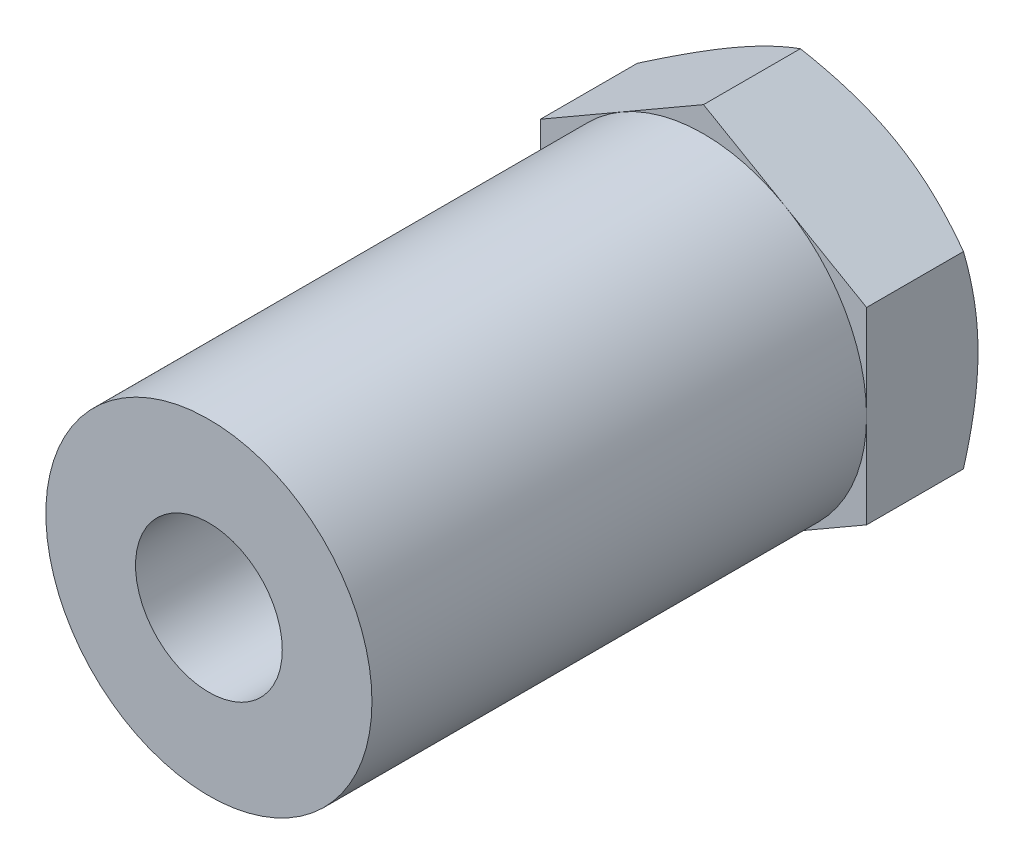
ISO-10303-21;
HEADER;
FILE_DESCRIPTION(('STEP AP214'),'2;1');
FILE_NAME('part.step','',(''),(''),'','','');
FILE_SCHEMA(('AUTOMOTIVE_DESIGN { 1 0 10303 214 1 1 1 1 }'));
ENDSEC;
DATA;
#1=APPLICATION_CONTEXT('core data for automotive mechanical design processes');
#2=APPLICATION_PROTOCOL_DEFINITION('international standard','automotive_design',2000,#1);
#3=PRODUCT_CONTEXT('',#1,'mechanical');
#4=PRODUCT('Part','Part','',(#3));
#5=PRODUCT_RELATED_PRODUCT_CATEGORY('part','',(#4));
#6=PRODUCT_DEFINITION_FORMATION('','',#4);
#7=PRODUCT_DEFINITION_CONTEXT('part definition',#1,'design');
#8=PRODUCT_DEFINITION('design','',#6,#7);
#9=PRODUCT_DEFINITION_SHAPE('','',#8);
#10=(LENGTH_UNIT() NAMED_UNIT(*) SI_UNIT(.MILLI.,.METRE.));
#11=(NAMED_UNIT(*) PLANE_ANGLE_UNIT() SI_UNIT($,.RADIAN.));
#12=(NAMED_UNIT(*) SI_UNIT($,.STERADIAN.) SOLID_ANGLE_UNIT());
#13=UNCERTAINTY_MEASURE_WITH_UNIT(LENGTH_MEASURE(1.E-05),#10,'distance_accuracy_value','');
#14=(GEOMETRIC_REPRESENTATION_CONTEXT(3) GLOBAL_UNCERTAINTY_ASSIGNED_CONTEXT((#13)) GLOBAL_UNIT_ASSIGNED_CONTEXT((#10,
#11,#12)) REPRESENTATION_CONTEXT('',''));
#15=CARTESIAN_POINT('',(0.,0.,0.));
#16=DIRECTION('',(0.,0.,1.));
#17=DIRECTION('',(1.,0.,0.));
#18=AXIS2_PLACEMENT_3D('',#15,#16,#17);
#19=CARTESIAN_POINT('',(0.,0.64507889346186,-6.6));
#20=DIRECTION('',(0.,0.,1.));
#21=DIRECTION('',(1.,0.,0.));
#22=AXIS2_PLACEMENT_3D('',#19,#20,#21);
#23=PLANE('',#22);
#24=CARTESIAN_POINT('',(0.,0.,-6.6));
#25=DIRECTION('',(0.,0.,1.));
#26=DIRECTION('',(1.,0.,0.));
#27=AXIS2_PLACEMENT_3D('',#24,#25,#26);
#28=CIRCLE('',#27,12.);
#29=CARTESIAN_POINT('',(12.,0.,-6.6));
#30=VERTEX_POINT('',#29);
#31=CARTESIAN_POINT('',(6.00000000000003,10.3923048454132,-6.6));
#32=VERTEX_POINT('',#31);
#33=EDGE_CURVE('E149',#30,#32,#28,.T.);
#34=ORIENTED_EDGE('',*,*,#33,.F.);
#35=DIRECTION('',(0.,1.,0.));
#36=VECTOR('',#35,1.);
#37=CARTESIAN_POINT('',(12.,6.92820323027548,-6.6));
#38=LINE('',#37,#36);
#39=CARTESIAN_POINT('',(12.,6.92820323027555,-6.6));
#40=VERTEX_POINT('',#39);
#41=EDGE_CURVE('E138',#30,#40,#38,.T.);
#42=ORIENTED_EDGE('',*,*,#41,.T.);
#43=DIRECTION('',(0.866025403784437,-0.500000000000003,0.));
#44=VECTOR('',#43,1.);
#45=CARTESIAN_POINT('',(12.,6.92820323027548,-6.6));
#46=LINE('',#45,#44);
#47=EDGE_CURVE('E137',#32,#40,#46,.T.);
#48=ORIENTED_EDGE('',*,*,#47,.F.);
#49=EDGE_LOOP('',(#34,#42,#48));
#50=FACE_BOUND('',#49,.T.);
#51=ADVANCED_FACE('F35',(#50),#23,.T.);
#52=CARTESIAN_POINT('',(-6.00000000000002,10.3923048454133,-6.6));
#53=VERTEX_POINT('',#52);
#54=EDGE_CURVE('E57',#32,#53,#28,.T.);
#55=ORIENTED_EDGE('',*,*,#54,.F.);
#56=CARTESIAN_POINT('',(0.,13.856406460551,-6.6));
#57=VERTEX_POINT('',#56);
#58=EDGE_CURVE('E173',#57,#32,#46,.T.);
#59=ORIENTED_EDGE('',*,*,#58,.F.);
#60=DIRECTION('',(0.866025403784438,0.500000000000002,0.));
#61=VECTOR('',#60,1.);
#62=CARTESIAN_POINT('',(0.,13.856406460551,-6.6));
#63=LINE('',#62,#61);
#64=EDGE_CURVE('E175',#53,#57,#63,.T.);
#65=ORIENTED_EDGE('',*,*,#64,.F.);
#66=EDGE_LOOP('',(#55,#59,#65));
#67=FACE_BOUND('',#66,.T.);
#68=ADVANCED_FACE('F262',(#67),#23,.T.);
#69=CARTESIAN_POINT('',(-12.,0.,-6.6));
#70=VERTEX_POINT('',#69);
#71=EDGE_CURVE('E50',#53,#70,#28,.T.);
#72=ORIENTED_EDGE('',*,*,#71,.F.);
#73=CARTESIAN_POINT('',(-12.,6.9282032302755,-6.6));
#74=VERTEX_POINT('',#73);
#75=EDGE_CURVE('E176',#74,#53,#63,.T.);
#76=ORIENTED_EDGE('',*,*,#75,.F.);
#77=DIRECTION('',(0.,1.,0.));
#78=VECTOR('',#77,1.);
#79=CARTESIAN_POINT('',(-12.,6.9282032302755,-6.6));
#80=LINE('',#79,#78);
#81=EDGE_CURVE('E162',#70,#74,#80,.T.);
#82=ORIENTED_EDGE('',*,*,#81,.F.);
#83=EDGE_LOOP('',(#72,#76,#82));
#84=FACE_BOUND('',#83,.T.);
#85=ADVANCED_FACE('F268',(#84),#23,.T.);
#86=CARTESIAN_POINT('',(-6.00000000000005,-10.3923048454133,-6.6));
#87=VERTEX_POINT('',#86);
#88=EDGE_CURVE('E160',#70,#87,#28,.T.);
#89=ORIENTED_EDGE('',*,*,#88,.F.);
#90=CARTESIAN_POINT('',(-12.,-6.92820323027555,-6.6));
#91=VERTEX_POINT('',#90);
#92=EDGE_CURVE('E159',#91,#70,#80,.T.);
#93=ORIENTED_EDGE('',*,*,#92,.F.);
#94=DIRECTION('',(-0.866025403784437,0.500000000000002,0.));
#95=VECTOR('',#94,1.);
#96=CARTESIAN_POINT('',(-12.,-6.92820323027554,-6.6));
#97=LINE('',#96,#95);
#98=EDGE_CURVE('E171',#87,#91,#97,.T.);
#99=ORIENTED_EDGE('',*,*,#98,.F.);
#100=EDGE_LOOP('',(#89,#93,#99));
#101=FACE_BOUND('',#100,.T.);
#102=ADVANCED_FACE('F280',(#101),#23,.T.);
#103=CARTESIAN_POINT('',(6.00000000000004,-10.3923048454133,-6.6));
#104=VERTEX_POINT('',#103);
#105=EDGE_CURVE('E158',#87,#104,#28,.T.);
#106=ORIENTED_EDGE('',*,*,#105,.F.);
#107=CARTESIAN_POINT('',(0.,-13.856406460551,-6.6));
#108=VERTEX_POINT('',#107);
#109=EDGE_CURVE('E167',#108,#87,#97,.T.);
#110=ORIENTED_EDGE('',*,*,#109,.F.);
#111=DIRECTION('',(-0.866025403784438,-0.500000000000001,0.));
#112=VECTOR('',#111,1.);
#113=CARTESIAN_POINT('',(0.,-13.8564064605511,-6.6));
#114=LINE('',#113,#112);
#115=EDGE_CURVE('E170',#104,#108,#114,.T.);
#116=ORIENTED_EDGE('',*,*,#115,.F.);
#117=EDGE_LOOP('',(#106,#110,#116));
#118=FACE_BOUND('',#117,.T.);
#119=ADVANCED_FACE('F258',(#118),#23,.T.);
#120=CARTESIAN_POINT('',(0.,0.,-14.8));
#121=DIRECTION('',(0.,0.,1.));
#122=DIRECTION('',(1.,0.,0.));
#123=AXIS2_PLACEMENT_3D('',#120,#121,#122);
#124=CYLINDRICAL_SURFACE('',#123,7.);
#125=CARTESIAN_POINT('',(0.,0.,4.2));
#126=DIRECTION('',(0.,0.,-1.));
#127=DIRECTION('',(-1.,0.,0.));
#128=AXIS2_PLACEMENT_3D('',#125,#126,#127);
#129=CIRCLE('',#128,7.);
#130=CARTESIAN_POINT('',(-7.,0.,4.2));
#131=VERTEX_POINT('',#130);
#132=EDGE_CURVE('E11',#131,#131,#129,.F.);
#133=ORIENTED_EDGE('',*,*,#132,.T.);
#134=EDGE_LOOP('',(#133));
#135=FACE_BOUND('',#134,.T.);
#136=CARTESIAN_POINT('',(0.,0.,-14.0743924617903));
#137=DIRECTION('',(0.,0.,-1.));
#138=DIRECTION('',(-1.,0.,0.));
#139=AXIS2_PLACEMENT_3D('',#136,#137,#138);
#140=CIRCLE('',#139,7.);
#141=CARTESIAN_POINT('',(-7.,0.,-14.0743924617903));
#142=VERTEX_POINT('',#141);
#143=EDGE_CURVE('E187',#142,#142,#140,.F.);
#144=ORIENTED_EDGE('',*,*,#143,.F.);
#145=EDGE_LOOP('',(#144));
#146=FACE_BOUND('',#145,.T.);
#147=ADVANCED_FACE('F214',(#135,#146),#124,.F.);
#148=CARTESIAN_POINT('',(0.,13.856406460551,-14.8));
#149=DIRECTION('',(-0.500000000000002,0.866025403784438,0.));
#150=DIRECTION('',(-0.866025403784438,-0.500000000000002,0.));
#151=AXIS2_PLACEMENT_3D('',#148,#149,#150);
#152=PLANE('',#151);
#153=DIRECTION('',(0.,0.,1.));
#154=VECTOR('',#153,1.);
#155=CARTESIAN_POINT('',(-12.,6.9282032302755,-14.8));
#156=LINE('',#155,#154);
#157=CARTESIAN_POINT('',(-12.,6.92820323027555,-13.7282032302755));
#158=VERTEX_POINT('',#157);
#159=EDGE_CURVE('E313',#158,#74,#156,.T.);
#160=ORIENTED_EDGE('',*,*,#159,.T.);
#161=ORIENTED_EDGE('',*,*,#75,.T.);
#162=ORIENTED_EDGE('',*,*,#64,.T.);
#163=DIRECTION('',(0.,0.,1.));
#164=VECTOR('',#163,1.);
#165=CARTESIAN_POINT('',(0.,13.856406460551,-14.8));
#166=LINE('',#165,#164);
#167=CARTESIAN_POINT('',(0.,13.856406460551,-13.7282032302755));
#168=VERTEX_POINT('',#167);
#169=EDGE_CURVE('E311',#168,#57,#166,.T.);
#170=ORIENTED_EDGE('',*,*,#169,.F.);
#171=CARTESIAN_POINT('',(-12.0002,6.92808776022166,-13.7281365627755));
#172=CARTESIAN_POINT('',(-11.7364142047577,7.08038456011318,-13.8160503678141));
#173=CARTESIAN_POINT('',(-11.4716448806182,7.2332492006783,-13.8999740024433));
#174=CARTESIAN_POINT('',(-10.9399829834703,7.54020434011448,-14.0587337811272));
#175=CARTESIAN_POINT('',(-10.6730897427069,7.69429522451413,-14.1335669363264));
#176=CARTESIAN_POINT('',(-9.86810959402099,8.15905073005026,-14.3429824601458));
#177=CARTESIAN_POINT('',(-9.3268449261749,8.47155003173404,-14.4620967632772));
#178=CARTESIAN_POINT('',(-8.516867170845,8.93919090681137,-14.6017689389969));
#179=CARTESIAN_POINT('',(-8.25057389951863,9.09293539869504,-14.6415562029596));
#180=CARTESIAN_POINT('',(-7.71675440130316,9.40113622968841,-14.7082766307829));
#181=CARTESIAN_POINT('',(-7.44922815078262,9.55559258244173,-14.7352095472322));
#182=CARTESIAN_POINT('',(-6.91372963367465,9.86476279544467,-14.7755314080831));
#183=CARTESIAN_POINT('',(-6.64575827793127,10.0194761298182,-14.7889364471177));
#184=CARTESIAN_POINT('',(-6.10956726772596,10.3290461538973,-14.8019169062428));
#185=CARTESIAN_POINT('',(-5.84134762119196,10.4839028390257,-14.8014927536373));
#186=CARTESIAN_POINT('',(-5.3399106212159,10.7734076259435,-14.7877799806572));
#187=CARTESIAN_POINT('',(-5.10665750682225,10.908076374328,-14.7761640174215));
#188=CARTESIAN_POINT('',(-4.64068775826923,11.1771041340893,-14.7426919911276));
#189=CARTESIAN_POINT('',(-4.40797116322823,11.3114631228811,-14.7208352037338));
#190=CARTESIAN_POINT('',(-3.94320092395706,11.5797983456356,-14.6672625834571));
#191=CARTESIAN_POINT('',(-3.711147987638,11.7137741708857,-14.6355386075071));
#192=CARTESIAN_POINT('',(-3.24813003269502,11.9810977118117,-14.5627882243296));
#193=CARTESIAN_POINT('',(-3.01716508910646,12.1144453841659,-14.5217611848168));
#194=CARTESIAN_POINT('',(-2.31605804123633,12.5192297269844,-14.3836883467182));
#195=CARTESIAN_POINT('',(-1.84794625372147,12.789494193517,-14.2728751116607));
#196=CARTESIAN_POINT('',(-0.918702892408574,13.3259930983137,-14.0213742330621));
#197=CARTESIAN_POINT('',(-0.457559420707841,13.5922344058351,-13.8807456573406));
#198=CARTESIAN_POINT('',(0.000200000000004228,13.8565219306049,-13.7281365627755));
#199=B_SPLINE_CURVE_WITH_KNOTS('',3,(#171,#172,#173,#174,#175,#176,#177,#178,#179,#180,#181,
#182,#183,#184,#185,#186,#187,#188,#189,#190,#191,#192,#193,#194,#195,#196,#197,#198),
.UNSPECIFIED.,.F.,.F.,(4,2,2,2,2,2,2,2,2,2,2,2,2,4),(0.,0.951004872251248,1.90232158356438,
3.80900466161369,4.73894551413571,5.6689042647761,6.59775529889866,7.52657763276931,
8.33514643820579,9.1437724425275,9.95306755799766,10.7624176939264,12.4167102786892,
14.0677556316692),.UNSPECIFIED.);
#200=CARTESIAN_POINT('',(-6.00000000000002,10.3923048454133,-14.8));
#201=VERTEX_POINT('',#200);
#202=EDGE_CURVE('E240',#201,#168,#199,.T.);
#203=ORIENTED_EDGE('',*,*,#202,.F.);
#204=EDGE_CURVE('E234',#158,#201,#199,.T.);
#205=ORIENTED_EDGE('',*,*,#204,.F.);
#206=EDGE_LOOP('',(#160,#161,#162,#170,#203,#205));
#207=FACE_BOUND('',#206,.T.);
#208=ADVANCED_FACE('F247',(#207),#152,.T.);
#209=CARTESIAN_POINT('',(12.,6.92820323027548,-14.8));
#210=DIRECTION('',(0.500000000000003,0.866025403784437,0.));
#211=DIRECTION('',(-0.866025403784437,0.500000000000003,0.));
#212=AXIS2_PLACEMENT_3D('',#209,#210,#211);
#213=PLANE('',#212);
#214=ORIENTED_EDGE('',*,*,#169,.T.);
#215=ORIENTED_EDGE('',*,*,#58,.T.);
#216=ORIENTED_EDGE('',*,*,#47,.T.);
#217=DIRECTION('',(0.,0.,1.));
#218=VECTOR('',#217,1.);
#219=CARTESIAN_POINT('',(12.,6.92820323027548,-14.8));
#220=LINE('',#219,#218);
#221=CARTESIAN_POINT('',(12.,6.92820323027555,-13.7282032302755));
#222=VERTEX_POINT('',#221);
#223=EDGE_CURVE('E146',#222,#40,#220,.T.);
#224=ORIENTED_EDGE('',*,*,#223,.F.);
#225=CARTESIAN_POINT('',(-0.000199999999996007,13.8565219306049,-13.7281365627755));
#226=CARTESIAN_POINT('',(0.263585795242266,13.7042251307134,-13.8160503678141));
#227=CARTESIAN_POINT('',(0.528355119381804,13.5513604901482,-13.8999740024433));
#228=CARTESIAN_POINT('',(1.06001701652967,13.2444053507121,-14.0587337811271));
#229=CARTESIAN_POINT('',(1.32691025729307,13.0903144663124,-14.1335669363264));
#230=CARTESIAN_POINT('',(2.13189040597901,12.6255589607763,-14.3429824601458));
#231=CARTESIAN_POINT('',(2.67315507382511,12.3130596590925,-14.4620967632771));
#232=CARTESIAN_POINT('',(3.483132829155,11.8454187840152,-14.6017689389969));
#233=CARTESIAN_POINT('',(3.74942610048138,11.6916742921315,-14.6415562029596));
#234=CARTESIAN_POINT('',(4.28324559869685,11.3834734611381,-14.7082766307829));
#235=CARTESIAN_POINT('',(4.55077184921739,11.2290171083848,-14.7352095472322));
#236=CARTESIAN_POINT('',(5.08627036632536,10.9198468953819,-14.7755314080831));
#237=CARTESIAN_POINT('',(5.35424172206873,10.7651335610083,-14.7889364471177));
#238=CARTESIAN_POINT('',(5.89043273227405,10.4555635369292,-14.8019169062428));
#239=CARTESIAN_POINT('',(6.15865237880805,10.3007068518009,-14.8014927536373));
#240=CARTESIAN_POINT('',(6.66008937878411,10.011202064883,-14.7877799806572));
#241=CARTESIAN_POINT('',(6.89334249317776,9.87653331649855,-14.7761640174215));
#242=CARTESIAN_POINT('',(7.35931224173078,9.60750555673724,-14.7426919911276));
#243=CARTESIAN_POINT('',(7.59202883677178,9.47314656794542,-14.7208352037338));
#244=CARTESIAN_POINT('',(8.05679907604295,9.20481134519088,-14.6672625834571));
#245=CARTESIAN_POINT('',(8.28885201236201,9.07083551994083,-14.6355386075071));
#246=CARTESIAN_POINT('',(8.75186996730499,8.80351197901487,-14.5627882243296));
#247=CARTESIAN_POINT('',(8.98283491089355,8.67016430666065,-14.5217611848168));
#248=CARTESIAN_POINT('',(9.68394195876367,8.26537996384208,-14.3836883467182));
#249=CARTESIAN_POINT('',(10.1520537462785,7.99511549730954,-14.2728751116607));
#250=CARTESIAN_POINT('',(11.0812971075914,7.45861659251286,-14.0213742330621));
#251=CARTESIAN_POINT('',(11.5424405792922,7.1923752849914,-13.8807456573406));
#252=CARTESIAN_POINT('',(12.0002,6.92808776022164,-13.7281365627755));
#253=B_SPLINE_CURVE_WITH_KNOTS('',3,(#225,#226,#227,#228,#229,#230,#231,#232,#233,#234,#235,
#236,#237,#238,#239,#240,#241,#242,#243,#244,#245,#246,#247,#248,#249,#250,#251,#252),
.UNSPECIFIED.,.F.,.F.,(4,2,2,2,2,2,2,2,2,2,2,2,2,4),(0.,0.951004872251249,1.90232158356438,
3.8090046616137,4.73894551413572,5.66890426477611,6.59775529889867,7.52657763276932,
8.33514643820581,9.14377244252752,9.95306755799768,10.7624176939264,12.4167102786892,
14.0677556316692),.UNSPECIFIED.);
#254=CARTESIAN_POINT('',(6.00000000000003,10.3923048454132,-14.8));
#255=VERTEX_POINT('',#254);
#256=EDGE_CURVE('E241',#255,#222,#253,.T.);
#257=ORIENTED_EDGE('',*,*,#256,.F.);
#258=EDGE_CURVE('E324',#168,#255,#253,.T.);
#259=ORIENTED_EDGE('',*,*,#258,.F.);
#260=EDGE_LOOP('',(#214,#215,#216,#224,#257,#259));
#261=FACE_BOUND('',#260,.T.);
#262=ADVANCED_FACE('F250',(#261),#213,.T.);
#263=CARTESIAN_POINT('',(12.,6.92820323027548,-14.8));
#264=DIRECTION('',(-1.,0.,0.));
#265=DIRECTION('',(0.,0.,1.));
#266=AXIS2_PLACEMENT_3D('',#263,#264,#265);
#267=PLANE('',#266);
#268=CARTESIAN_POINT('',(12.,-6.92820323027556,-6.6));
#269=VERTEX_POINT('',#268);
#270=EDGE_CURVE('E126',#269,#30,#38,.T.);
#271=ORIENTED_EDGE('',*,*,#270,.F.);
#272=DIRECTION('',(0.,0.,1.));
#273=VECTOR('',#272,1.);
#274=CARTESIAN_POINT('',(12.,-6.92820323027556,-14.8));
#275=LINE('',#274,#273);
#276=CARTESIAN_POINT('',(12.,-6.92820323027556,-13.7282032302755));
#277=VERTEX_POINT('',#276);
#278=EDGE_CURVE('E318',#277,#269,#275,.T.);
#279=ORIENTED_EDGE('',*,*,#278,.F.);
#280=CARTESIAN_POINT('',(12.,-18.3746159698766,-9.05767953627815));
#281=CARTESIAN_POINT('',(12.,-18.111191826486,-9.1850148607661));
#282=CARTESIAN_POINT('',(12.,-17.8474492817227,-9.31169116878767));
#283=CARTESIAN_POINT('',(12.,-17.3192601229198,-9.56357448321064));
#284=CARTESIAN_POINT('',(12.,-17.0548135011846,-9.68878147347116));
#285=CARTESIAN_POINT('',(12.,-16.2602391639796,-10.0620078465127));
#286=CARTESIAN_POINT('',(12.,-15.7289626157829,-10.3075911151424));
#287=CARTESIAN_POINT('',(12.,-14.659698083513,-10.7920811242619));
#288=CARTESIAN_POINT('',(12.,-14.1216890909037,-11.0309416152904));
#289=CARTESIAN_POINT('',(12.,-13.0412497182118,-11.4984070433223));
#290=CARTESIAN_POINT('',(12.,-12.4988195703415,-11.7270125149004));
#291=CARTESIAN_POINT('',(12.,-11.4019415707821,-12.1739483409353));
#292=CARTESIAN_POINT('',(12.,-10.8474279352457,-12.392118092926));
#293=CARTESIAN_POINT('',(12.,-9.73185625315837,-12.8113713615543));
#294=CARTESIAN_POINT('',(12.,-9.17079748637076,-13.0124529772262));
#295=CARTESIAN_POINT('',(12.,-8.04241377293588,-13.3921242458872));
#296=CARTESIAN_POINT('',(12.,-7.47510504864872,-13.5707617167711));
#297=CARTESIAN_POINT('',(12.,-6.33236790679924,-13.8997519086168));
#298=CARTESIAN_POINT('',(12.,-5.75694211908225,-14.0501135742196));
#299=CARTESIAN_POINT('',(12.,-4.88760620841686,-14.2489449441375));
#300=CARTESIAN_POINT('',(12.,-4.59673300881534,-14.3107803839525));
#301=CARTESIAN_POINT('',(12.,-4.01305048396678,-14.424571180157));
#302=CARTESIAN_POINT('',(12.,-3.72024120100053,-14.4765267515737));
#303=CARTESIAN_POINT('',(12.,-3.1328772773524,-14.5696376017916));
#304=CARTESIAN_POINT('',(12.,-2.83832249610628,-14.6107919983525));
#305=CARTESIAN_POINT('',(12.,-2.24782315371647,-14.6814710292247));
#306=CARTESIAN_POINT('',(12.,-1.95187864865482,-14.7109961288215));
#307=CARTESIAN_POINT('',(12.,-1.36089234495214,-14.7576246118791));
#308=CARTESIAN_POINT('',(12.,-1.06585670022771,-14.7748054835935));
#309=CARTESIAN_POINT('',(12.,-0.475323226777291,-14.7966542651734));
#310=CARTESIAN_POINT('',(12.,-0.179825404103213,-14.8013223375353));
#311=CARTESIAN_POINT('',(12.,0.411018209391806,-14.7980347725873));
#312=CARTESIAN_POINT('',(12.,0.706364019605407,-14.7900826780863));
#313=CARTESIAN_POINT('',(12.,1.29646300031967,-14.7617523990829));
#314=CARTESIAN_POINT('',(12.,1.59121614048712,-14.7413735940375));
#315=CARTESIAN_POINT('',(12.,2.30560702878382,-14.6773472090048));
#316=CARTESIAN_POINT('',(12.,2.72469590429755,-14.6274734164246));
#317=CARTESIAN_POINT('',(12.,3.55966217170487,-14.5053725427506));
#318=CARTESIAN_POINT('',(12.,3.97553865552049,-14.4331393622207));
#319=CARTESIAN_POINT('',(12.,4.80373712034422,-14.2688815045922));
#320=CARTESIAN_POINT('',(12.,5.21605535435656,-14.1768381138834));
#321=CARTESIAN_POINT('',(12.,6.03644960579824,-13.9757685147248));
#322=CARTESIAN_POINT('',(12.,6.44452601892292,-13.866743905801));
#323=CARTESIAN_POINT('',(12.,7.26648771462055,-13.6314690360774));
#324=CARTESIAN_POINT('',(12.,7.6802701941827,-13.5048620444483));
#325=CARTESIAN_POINT('',(12.,8.50346065874728,-13.2391423921067));
#326=CARTESIAN_POINT('',(12.,8.91287144608803,-13.1000383570737));
#327=CARTESIAN_POINT('',(12.,9.72567950730296,-12.8121802865323));
#328=CARTESIAN_POINT('',(12.,10.1290976583403,-12.6634849747962));
#329=CARTESIAN_POINT('',(12.,10.7318330075332,-12.4339493829362));
#330=CARTESIAN_POINT('',(12.,10.9323890596672,-12.3563380084009));
#331=CARTESIAN_POINT('',(12.,11.3327210550073,-12.1991414165315));
#332=CARTESIAN_POINT('',(12.,11.5324970162612,-12.1195562451795));
#333=CARTESIAN_POINT('',(12.,11.7319109696002,-12.0390729803747));
#334=B_SPLINE_CURVE_WITH_KNOTS('',3,(#280,#281,#282,#283,#284,#285,#286,#287,#288,#289,#290,
#291,#292,#293,#294,#295,#296,#297,#298,#299,#300,#301,#302,#303,#304,#305,#306,#307,#308,#309,
#310,#311,#312,#313,#314,#315,#316,#317,#318,#319,#320,#321,#322,#323,#324,#325,#326,#327,#328,
#329,#330,#331,#332,#333),.UNSPECIFIED.,.F.,.F.,(4,2,2,2,2,2,2,2,2,2,2,2,2,2,2,2,2,2,2,2,2,2,2,
2,2,2,4),(0.,0.877756274437961,1.75552218228205,3.51133949648298,5.27720464406482,
7.04297763322993,8.83042883460969,10.6180786210058,12.4018527456128,14.1850616464292,
15.0770405430691,15.9690000243079,16.861032338177,17.7530289584235,18.63937614315,
19.5257118173377,20.4117987180715,21.2979298702602,22.5633628824823,23.8291413978917,
25.0961209138468,26.3629811602517,27.6608948763425,28.9579195329089,30.2476436633466,
30.8927835422015,31.5379084058554),.UNSPECIFIED.);
#335=CARTESIAN_POINT('',(12.,0.,-14.8));
#336=VERTEX_POINT('',#335);
#337=EDGE_CURVE('E228',#277,#336,#334,.T.);
#338=ORIENTED_EDGE('',*,*,#337,.T.);
#339=EDGE_CURVE('E239',#336,#222,#334,.T.);
#340=ORIENTED_EDGE('',*,*,#339,.T.);
#341=ORIENTED_EDGE('',*,*,#223,.T.);
#342=ORIENTED_EDGE('',*,*,#41,.F.);
#343=EDGE_LOOP('',(#271,#279,#338,#340,#341,#342));
#344=FACE_BOUND('',#343,.T.);
#345=ADVANCED_FACE('F143',(#344),#267,.F.);
#346=CARTESIAN_POINT('',(0.,-13.8564064605511,-14.8));
#347=DIRECTION('',(0.500000000000001,-0.866025403784438,0.));
#348=DIRECTION('',(0.866025403784438,0.500000000000001,0.));
#349=AXIS2_PLACEMENT_3D('',#346,#347,#348);
#350=PLANE('',#349);
#351=ORIENTED_EDGE('',*,*,#278,.T.);
#352=EDGE_CURVE('E133',#269,#104,#114,.T.);
#353=ORIENTED_EDGE('',*,*,#352,.T.);
#354=ORIENTED_EDGE('',*,*,#115,.T.);
#355=DIRECTION('',(0.,0.,1.));
#356=VECTOR('',#355,1.);
#357=CARTESIAN_POINT('',(0.,-13.8564064605511,-14.8));
#358=LINE('',#357,#356);
#359=CARTESIAN_POINT('',(0.,-13.856406460551,-13.7282032302755));
#360=VERTEX_POINT('',#359);
#361=EDGE_CURVE('E295',#360,#108,#358,.T.);
#362=ORIENTED_EDGE('',*,*,#361,.F.);
#363=CARTESIAN_POINT('',(12.0002,-6.92808776022172,-13.7281365627755));
#364=CARTESIAN_POINT('',(11.7364142047577,-7.08038456011324,-13.8160503678141));
#365=CARTESIAN_POINT('',(11.4716448806182,-7.23324920067836,-13.8999740024433));
#366=CARTESIAN_POINT('',(10.9399829834703,-7.54020434011454,-14.0587337811271));
#367=CARTESIAN_POINT('',(10.6730897427069,-7.69429522451419,-14.1335669363264));
#368=CARTESIAN_POINT('',(9.86810959402099,-8.15905073005032,-14.3429824601458));
#369=CARTESIAN_POINT('',(9.32684492617489,-8.4715500317341,-14.4620967632771));
#370=CARTESIAN_POINT('',(8.51686717084499,-8.93919090681143,-14.6017689389968));
#371=CARTESIAN_POINT('',(8.25057389951862,-9.0929353986951,-14.6415562029595));
#372=CARTESIAN_POINT('',(7.71675440130315,-9.40113622968847,-14.7082766307829));
#373=CARTESIAN_POINT('',(7.44922815078261,-9.5555925824418,-14.7352095472322));
#374=CARTESIAN_POINT('',(6.91372963367464,-9.86476279544473,-14.7755314080831));
#375=CARTESIAN_POINT('',(6.64575827793126,-10.0194761298183,-14.7889364471177));
#376=CARTESIAN_POINT('',(6.10956726772595,-10.3290461538974,-14.8019169062428));
#377=CARTESIAN_POINT('',(5.84134762119195,-10.4839028390257,-14.8014927536372));
#378=CARTESIAN_POINT('',(5.33991062121588,-10.7734076259435,-14.7877799806572));
#379=CARTESIAN_POINT('',(5.10665750682223,-10.908076374328,-14.7761640174214));
#380=CARTESIAN_POINT('',(4.64068775826922,-11.1771041340893,-14.7426919911276));
#381=CARTESIAN_POINT('',(4.40797116322822,-11.3114631228812,-14.7208352037337));
#382=CARTESIAN_POINT('',(3.94320092395704,-11.5797983456357,-14.6672625834571));
#383=CARTESIAN_POINT('',(3.71114798763799,-11.7137741708858,-14.635538607507));
#384=CARTESIAN_POINT('',(3.24813003269501,-11.9810977118117,-14.5627882243295));
#385=CARTESIAN_POINT('',(3.01716508910645,-12.1144453841659,-14.5217611848168));
#386=CARTESIAN_POINT('',(2.31605804123632,-12.5192297269845,-14.3836883467182));
#387=CARTESIAN_POINT('',(1.84794625372146,-12.789494193517,-14.2728751116606));
#388=CARTESIAN_POINT('',(0.918702892408572,-13.3259930983137,-14.0213742330621));
#389=CARTESIAN_POINT('',(0.45755942070784,-13.5922344058352,-13.8807456573406));
#390=CARTESIAN_POINT('',(-0.000200000000003179,-13.8565219306049,-13.7281365627755));
#391=B_SPLINE_CURVE_WITH_KNOTS('',3,(#363,#364,#365,#366,#367,#368,#369,#370,#371,#372,#373,
#374,#375,#376,#377,#378,#379,#380,#381,#382,#383,#384,#385,#386,#387,#388,#389,#390),
.UNSPECIFIED.,.F.,.F.,(4,2,2,2,2,2,2,2,2,2,2,2,2,4),(0.,0.951004872251247,1.90232158356438,
3.8090046616137,4.73894551413572,5.66890426477611,6.59775529889867,7.52657763276933,
8.33514643820581,9.14377244252751,9.95306755799768,10.7624176939264,12.4167102786892,
14.0677556316692),.UNSPECIFIED.);
#392=CARTESIAN_POINT('',(6.00000000000002,-10.3923048454133,-14.8));
#393=VERTEX_POINT('',#392);
#394=EDGE_CURVE('E222',#393,#360,#391,.T.);
#395=ORIENTED_EDGE('',*,*,#394,.F.);
#396=EDGE_CURVE('E357',#277,#393,#391,.T.);
#397=ORIENTED_EDGE('',*,*,#396,.F.);
#398=EDGE_LOOP('',(#351,#353,#354,#362,#395,#397));
#399=FACE_BOUND('',#398,.T.);
#400=ADVANCED_FACE('F359',(#399),#350,.T.);
#401=CARTESIAN_POINT('',(-12.,-6.92820323027554,-14.8));
#402=DIRECTION('',(-0.500000000000002,-0.866025403784437,0.));
#403=DIRECTION('',(0.866025403784437,-0.500000000000002,0.));
#404=AXIS2_PLACEMENT_3D('',#401,#402,#403);
#405=PLANE('',#404);
#406=ORIENTED_EDGE('',*,*,#361,.T.);
#407=ORIENTED_EDGE('',*,*,#109,.T.);
#408=ORIENTED_EDGE('',*,*,#98,.T.);
#409=DIRECTION('',(0.,0.,1.));
#410=VECTOR('',#409,1.);
#411=CARTESIAN_POINT('',(-12.,-6.92820323027554,-14.8));
#412=LINE('',#411,#410);
#413=CARTESIAN_POINT('',(-12.,-6.92820323027555,-13.7282032302755));
#414=VERTEX_POINT('',#413);
#415=EDGE_CURVE('E315',#414,#91,#412,.T.);
#416=ORIENTED_EDGE('',*,*,#415,.F.);
#417=CARTESIAN_POINT('',(0.000199999999994992,-13.8565219306049,-13.7281365627755));
#418=CARTESIAN_POINT('',(-0.263585795242269,-13.7042251307134,-13.8160503678141));
#419=CARTESIAN_POINT('',(-0.528355119381807,-13.5513604901483,-13.8999740024433));
#420=CARTESIAN_POINT('',(-1.06001701652967,-13.2444053507121,-14.0587337811271));
#421=CARTESIAN_POINT('',(-1.32691025729308,-13.0903144663125,-14.1335669363264));
#422=CARTESIAN_POINT('',(-2.13189040597902,-12.6255589607763,-14.3429824601458));
#423=CARTESIAN_POINT('',(-2.67315507382512,-12.3130596590925,-14.4620967632771));
#424=CARTESIAN_POINT('',(-3.48313282915502,-11.8454187840152,-14.6017689389968));
#425=CARTESIAN_POINT('',(-3.74942610048139,-11.6916742921315,-14.6415562029595));
#426=CARTESIAN_POINT('',(-4.28324559869686,-11.3834734611382,-14.7082766307829));
#427=CARTESIAN_POINT('',(-4.55077184921741,-11.2290171083848,-14.7352095472322));
#428=CARTESIAN_POINT('',(-5.08627036632538,-10.9198468953819,-14.775531408083));
#429=CARTESIAN_POINT('',(-5.35424172206876,-10.7651335610084,-14.7889364471177));
#430=CARTESIAN_POINT('',(-5.89043273227407,-10.4555635369293,-14.8019169062428));
#431=CARTESIAN_POINT('',(-6.15865237880807,-10.3007068518009,-14.8014927536372));
#432=CARTESIAN_POINT('',(-6.66008937878414,-10.0112020648831,-14.7877799806572));
#433=CARTESIAN_POINT('',(-6.89334249317779,-9.87653331649858,-14.7761640174214));
#434=CARTESIAN_POINT('',(-7.3593122417308,-9.60750555673728,-14.7426919911276));
#435=CARTESIAN_POINT('',(-7.5920288367718,-9.47314656794546,-14.7208352037338));
#436=CARTESIAN_POINT('',(-8.05679907604297,-9.20481134519092,-14.6672625834571));
#437=CARTESIAN_POINT('',(-8.28885201236203,-9.07083551994088,-14.6355386075071));
#438=CARTESIAN_POINT('',(-8.751869967305,-8.80351197901492,-14.5627882243295));
#439=CARTESIAN_POINT('',(-8.98283491089356,-8.67016430666069,-14.5217611848168));
#440=CARTESIAN_POINT('',(-9.68394195876368,-8.26537996384213,-14.3836883467182));
#441=CARTESIAN_POINT('',(-10.1520537462785,-7.99511549730959,-14.2728751116607));
#442=CARTESIAN_POINT('',(-11.0812971075914,-7.45861659251292,-14.0213742330621));
#443=CARTESIAN_POINT('',(-11.5424405792922,-7.19237528499146,-13.8807456573406));
#444=CARTESIAN_POINT('',(-12.0002,-6.9280877602217,-13.7281365627755));
#445=B_SPLINE_CURVE_WITH_KNOTS('',3,(#417,#418,#419,#420,#421,#422,#423,#424,#425,#426,#427,
#428,#429,#430,#431,#432,#433,#434,#435,#436,#437,#438,#439,#440,#441,#442,#443,#444),
.UNSPECIFIED.,.F.,.F.,(4,2,2,2,2,2,2,2,2,2,2,2,2,4),(0.,0.951004872251251,1.90232158356439,
3.80900466161371,4.73894551413573,5.66890426477613,6.5977552988987,7.52657763276935,
8.33514643820583,9.14377244252754,9.9530675579977,10.7624176939264,12.4167102786892,
14.0677556316692),.UNSPECIFIED.);
#446=CARTESIAN_POINT('',(-6.00000000000003,-10.3923048454132,-14.8));
#447=VERTEX_POINT('',#446);
#448=EDGE_CURVE('E195',#447,#414,#445,.T.);
#449=ORIENTED_EDGE('',*,*,#448,.F.);
#450=EDGE_CURVE('E333',#360,#447,#445,.T.);
#451=ORIENTED_EDGE('',*,*,#450,.F.);
#452=EDGE_LOOP('',(#406,#407,#408,#416,#449,#451));
#453=FACE_BOUND('',#452,.T.);
#454=ADVANCED_FACE('F292',(#453),#405,.T.);
#455=CARTESIAN_POINT('',(-12.,6.9282032302755,-14.8));
#456=DIRECTION('',(-1.,0.,0.));
#457=DIRECTION('',(0.,0.,1.));
#458=AXIS2_PLACEMENT_3D('',#455,#456,#457);
#459=PLANE('',#458);
#460=ORIENTED_EDGE('',*,*,#415,.T.);
#461=ORIENTED_EDGE('',*,*,#92,.T.);
#462=ORIENTED_EDGE('',*,*,#81,.T.);
#463=ORIENTED_EDGE('',*,*,#159,.F.);
#464=CARTESIAN_POINT('',(-12.,-18.3746159698766,-9.05767953627816));
#465=CARTESIAN_POINT('',(-12.,-18.1111918264859,-9.18501486076611));
#466=CARTESIAN_POINT('',(-12.,-17.8474492817227,-9.31169116878768));
#467=CARTESIAN_POINT('',(-12.,-17.3192601229197,-9.56357448321065));
#468=CARTESIAN_POINT('',(-12.,-17.0548135011845,-9.68878147347117));
#469=CARTESIAN_POINT('',(-12.,-16.2602391639796,-10.0620078465127));
#470=CARTESIAN_POINT('',(-12.,-15.7289626157829,-10.3075911151425));
#471=CARTESIAN_POINT('',(-12.,-14.659698083513,-10.7920811242619));
#472=CARTESIAN_POINT('',(-12.,-14.1216890909037,-11.0309416152904));
#473=CARTESIAN_POINT('',(-12.,-13.0412497182117,-11.4984070433223));
#474=CARTESIAN_POINT('',(-12.,-12.4988195703414,-11.7270125149004));
#475=CARTESIAN_POINT('',(-12.,-11.4019415707821,-12.1739483409353));
#476=CARTESIAN_POINT('',(-12.,-10.8474279352457,-12.392118092926));
#477=CARTESIAN_POINT('',(-12.,-9.73185625315834,-12.8113713615544));
#478=CARTESIAN_POINT('',(-12.,-9.17079748637073,-13.0124529772262));
#479=CARTESIAN_POINT('',(-12.,-8.04241377293586,-13.3921242458872));
#480=CARTESIAN_POINT('',(-12.,-7.4751050486487,-13.5707617167711));
#481=CARTESIAN_POINT('',(-12.,-6.33236790679922,-13.8997519086168));
#482=CARTESIAN_POINT('',(-12.,-5.75694211908224,-14.0501135742196));
#483=CARTESIAN_POINT('',(-12.,-4.88760620841684,-14.2489449441375));
#484=CARTESIAN_POINT('',(-12.,-4.59673300881533,-14.3107803839525));
#485=CARTESIAN_POINT('',(-12.,-4.01305048396676,-14.424571180157));
#486=CARTESIAN_POINT('',(-12.,-3.72024120100051,-14.4765267515737));
#487=CARTESIAN_POINT('',(-12.,-3.13287727735239,-14.5696376017916));
#488=CARTESIAN_POINT('',(-12.,-2.83832249610626,-14.6107919983525));
#489=CARTESIAN_POINT('',(-12.,-2.24782315371646,-14.6814710292247));
#490=CARTESIAN_POINT('',(-12.,-1.9518786486548,-14.7109961288215));
#491=CARTESIAN_POINT('',(-12.,-1.36089234495213,-14.7576246118791));
#492=CARTESIAN_POINT('',(-12.,-1.06585670022769,-14.7748054835936));
#493=CARTESIAN_POINT('',(-12.,-0.475323226777274,-14.7966542651734));
#494=CARTESIAN_POINT('',(-12.,-0.179825404103197,-14.8013223375353));
#495=CARTESIAN_POINT('',(-12.,0.411018209391822,-14.7980347725873));
#496=CARTESIAN_POINT('',(-12.,0.706364019605423,-14.7900826780863));
#497=CARTESIAN_POINT('',(-12.,1.29646300031969,-14.7617523990829));
#498=CARTESIAN_POINT('',(-12.,1.59121614048713,-14.7413735940375));
#499=CARTESIAN_POINT('',(-12.,2.30560702878383,-14.6773472090048));
#500=CARTESIAN_POINT('',(-12.,2.72469590429756,-14.6274734164246));
#501=CARTESIAN_POINT('',(-12.,3.55966217170489,-14.5053725427505));
#502=CARTESIAN_POINT('',(-12.,3.97553865552051,-14.4331393622207));
#503=CARTESIAN_POINT('',(-12.,4.80373712034423,-14.2688815045922));
#504=CARTESIAN_POINT('',(-12.,5.21605535435658,-14.1768381138834));
#505=CARTESIAN_POINT('',(-12.,6.03644960579826,-13.9757685147248));
#506=CARTESIAN_POINT('',(-12.,6.44452601892293,-13.866743905801));
#507=CARTESIAN_POINT('',(-12.,7.26648771462056,-13.6314690360774));
#508=CARTESIAN_POINT('',(-12.,7.68027019418272,-13.5048620444483));
#509=CARTESIAN_POINT('',(-12.,8.5034606587473,-13.2391423921067));
#510=CARTESIAN_POINT('',(-12.,8.91287144608806,-13.1000383570737));
#511=CARTESIAN_POINT('',(-12.,9.72567950730298,-12.8121802865323));
#512=CARTESIAN_POINT('',(-12.,10.1290976583403,-12.6634849747962));
#513=CARTESIAN_POINT('',(-12.,10.7318330075332,-12.4339493829362));
#514=CARTESIAN_POINT('',(-12.,10.9323890596672,-12.3563380084009));
#515=CARTESIAN_POINT('',(-12.,11.3327210550073,-12.1991414165315));
#516=CARTESIAN_POINT('',(-12.,11.5324970162612,-12.1195562451794));
#517=CARTESIAN_POINT('',(-12.,11.7319109696003,-12.0390729803747));
#518=B_SPLINE_CURVE_WITH_KNOTS('',3,(#464,#465,#466,#467,#468,#469,#470,#471,#472,#473,#474,
#475,#476,#477,#478,#479,#480,#481,#482,#483,#484,#485,#486,#487,#488,#489,#490,#491,#492,#493,
#494,#495,#496,#497,#498,#499,#500,#501,#502,#503,#504,#505,#506,#507,#508,#509,#510,#511,#512,
#513,#514,#515,#516,#517),.UNSPECIFIED.,.F.,.F.,(4,2,2,2,2,2,2,2,2,2,2,2,2,2,2,2,2,2,2,2,2,2,2,
2,2,2,4),(0.,0.877756274437961,1.75552218228205,3.51133949648299,5.27720464406482,
7.04297763322994,8.83042883460969,10.6180786210058,12.4018527456128,14.1850616464292,
15.0770405430691,15.9690000243079,16.861032338177,17.7530289584235,18.63937614315,
19.5257118173377,20.4117987180715,21.2979298702602,22.5633628824823,23.8291413978917,
25.0961209138468,26.3629811602517,27.6608948763425,28.9579195329089,30.2476436633466,
30.8927835422016,31.5379084058554),.UNSPECIFIED.);
#519=CARTESIAN_POINT('',(-12.,0.,-14.8));
#520=VERTEX_POINT('',#519);
#521=EDGE_CURVE('E186',#520,#158,#518,.T.);
#522=ORIENTED_EDGE('',*,*,#521,.F.);
#523=EDGE_CURVE('E194',#414,#520,#518,.T.);
#524=ORIENTED_EDGE('',*,*,#523,.F.);
#525=EDGE_LOOP('',(#460,#461,#462,#463,#522,#524));
#526=FACE_BOUND('',#525,.T.);
#527=ADVANCED_FACE('F201',(#526),#459,.T.);
#528=CARTESIAN_POINT('',(0.,13.856406460551,-14.8));
#529=DIRECTION('',(0.,0.,-1.));
#530=DIRECTION('',(-1.,0.,0.));
#531=AXIS2_PLACEMENT_3D('',#528,#529,#530);
#532=PLANE('',#531);
#533=CARTESIAN_POINT('',(0.,0.,-14.8));
#534=DIRECTION('',(0.,0.,-1.));
#535=DIRECTION('',(-1.,0.,0.));
#536=AXIS2_PLACEMENT_3D('',#533,#534,#535);
#537=CIRCLE('',#536,12.);
#538=EDGE_CURVE('E312',#520,#447,#537,.F.);
#539=ORIENTED_EDGE('',*,*,#538,.F.);
#540=EDGE_CURVE('E307',#201,#520,#537,.F.);
#541=ORIENTED_EDGE('',*,*,#540,.F.);
#542=EDGE_CURVE('E310',#255,#201,#537,.F.);
#543=ORIENTED_EDGE('',*,*,#542,.F.);
#544=CARTESIAN_POINT('',(0.,0.,-14.8));
#545=DIRECTION('',(0.,0.,1.));
#546=DIRECTION('',(1.,0.,0.));
#547=AXIS2_PLACEMENT_3D('',#544,#545,#546);
#548=CIRCLE('',#547,12.);
#549=EDGE_CURVE('E183',#336,#255,#548,.T.);
#550=ORIENTED_EDGE('',*,*,#549,.F.);
#551=EDGE_CURVE('E347',#393,#336,#537,.F.);
#552=ORIENTED_EDGE('',*,*,#551,.F.);
#553=EDGE_CURVE('E346',#447,#393,#537,.F.);
#554=ORIENTED_EDGE('',*,*,#553,.F.);
#555=EDGE_LOOP('',(#539,#541,#543,#550,#552,#554));
#556=FACE_BOUND('',#555,.T.);
#557=CARTESIAN_POINT('',(0.,0.,-14.8));
#558=DIRECTION('',(0.,0.,-1.));
#559=DIRECTION('',(-1.,0.,0.));
#560=AXIS2_PLACEMENT_3D('',#557,#558,#559);
#561=CIRCLE('',#560,8.);
#562=CARTESIAN_POINT('',(-8.,0.,-14.8));
#563=VERTEX_POINT('',#562);
#564=EDGE_CURVE('E182',#563,#563,#561,.F.);
#565=ORIENTED_EDGE('',*,*,#564,.T.);
#566=EDGE_LOOP('',(#565));
#567=FACE_BOUND('',#566,.T.);
#568=ADVANCED_FACE('F341',(#556,#567),#532,.T.);
#569=CARTESIAN_POINT('',(0.,0.,-14.8));
#570=DIRECTION('',(0.,0.,1.));
#571=DIRECTION('',(1.,0.,0.));
#572=AXIS2_PLACEMENT_3D('',#569,#570,#571);
#573=CONICAL_SURFACE('',#572,12.,1.0471975511966);
#574=ORIENTED_EDGE('',*,*,#204,.T.);
#575=ORIENTED_EDGE('',*,*,#540,.T.);
#576=ORIENTED_EDGE('',*,*,#521,.T.);
#577=EDGE_LOOP('',(#574,#575,#576));
#578=FACE_BOUND('',#577,.T.);
#579=ADVANCED_FACE('F337',(#578),#573,.T.);
#580=ORIENTED_EDGE('',*,*,#202,.T.);
#581=ORIENTED_EDGE('',*,*,#258,.T.);
#582=ORIENTED_EDGE('',*,*,#542,.T.);
#583=EDGE_LOOP('',(#580,#581,#582));
#584=FACE_BOUND('',#583,.T.);
#585=ADVANCED_FACE('F211',(#584),#573,.T.);
#586=ORIENTED_EDGE('',*,*,#256,.T.);
#587=ORIENTED_EDGE('',*,*,#339,.F.);
#588=ORIENTED_EDGE('',*,*,#549,.T.);
#589=EDGE_LOOP('',(#586,#587,#588));
#590=FACE_BOUND('',#589,.T.);
#591=ADVANCED_FACE('F353',(#590),#573,.T.);
#592=ORIENTED_EDGE('',*,*,#396,.T.);
#593=ORIENTED_EDGE('',*,*,#551,.T.);
#594=ORIENTED_EDGE('',*,*,#337,.F.);
#595=EDGE_LOOP('',(#592,#593,#594));
#596=FACE_BOUND('',#595,.T.);
#597=ADVANCED_FACE('F373',(#596),#573,.T.);
#598=ORIENTED_EDGE('',*,*,#394,.T.);
#599=ORIENTED_EDGE('',*,*,#450,.T.);
#600=ORIENTED_EDGE('',*,*,#553,.T.);
#601=EDGE_LOOP('',(#598,#599,#600));
#602=FACE_BOUND('',#601,.T.);
#603=ADVANCED_FACE('F209',(#602),#573,.T.);
#604=ORIENTED_EDGE('',*,*,#448,.T.);
#605=ORIENTED_EDGE('',*,*,#523,.T.);
#606=ORIENTED_EDGE('',*,*,#538,.T.);
#607=EDGE_LOOP('',(#604,#605,#606));
#608=FACE_BOUND('',#607,.T.);
#609=ADVANCED_FACE('F203',(#608),#573,.T.);
#610=CARTESIAN_POINT('',(0.,0.,-14.7746));
#611=DIRECTION('',(0.,0.,-1.));
#612=DIRECTION('',(-1.,0.,0.));
#613=AXIS2_PLACEMENT_3D('',#610,#611,#612);
#614=CONICAL_SURFACE('',#613,8.,0.959931088596879);
#615=CARTESIAN_POINT('',(0.,0.,-14.7746));
#616=DIRECTION('',(0.,0.,1.));
#617=DIRECTION('',(1.,0.,0.));
#618=AXIS2_PLACEMENT_3D('',#615,#616,#617);
#619=CIRCLE('',#618,8.);
#620=CARTESIAN_POINT('',(8.,0.,-14.7746));
#621=VERTEX_POINT('',#620);
#622=EDGE_CURVE('E179',#621,#621,#619,.T.);
#623=ORIENTED_EDGE('',*,*,#622,.F.);
#624=EDGE_LOOP('',(#623));
#625=FACE_BOUND('',#624,.T.);
#626=ORIENTED_EDGE('',*,*,#143,.T.);
#627=EDGE_LOOP('',(#626));
#628=FACE_BOUND('',#627,.T.);
#629=ADVANCED_FACE('F208',(#625,#628),#614,.F.);
#630=CARTESIAN_POINT('',(0.,0.,-25.0375057290932));
#631=DIRECTION('',(0.,0.,1.));
#632=DIRECTION('',(1.,0.,0.));
#633=AXIS2_PLACEMENT_3D('',#630,#631,#632);
#634=CYLINDRICAL_SURFACE('',#633,8.);
#635=ORIENTED_EDGE('',*,*,#564,.F.);
#636=EDGE_LOOP('',(#635));
#637=FACE_BOUND('',#636,.T.);
#638=ORIENTED_EDGE('',*,*,#622,.T.);
#639=EDGE_LOOP('',(#638));
#640=FACE_BOUND('',#639,.T.);
#641=ADVANCED_FACE('F212',(#637,#640),#634,.F.);
#642=EDGE_CURVE('E130',#104,#30,#28,.T.);
#643=ORIENTED_EDGE('',*,*,#642,.F.);
#644=ORIENTED_EDGE('',*,*,#352,.F.);
#645=ORIENTED_EDGE('',*,*,#270,.T.);
#646=EDGE_LOOP('',(#643,#644,#645));
#647=FACE_BOUND('',#646,.T.);
#648=ADVANCED_FACE('F128',(#647),#23,.T.);
#649=CARTESIAN_POINT('',(0.,0.,29.8));
#650=DIRECTION('',(0.,0.,1.));
#651=DIRECTION('',(1.,0.,0.));
#652=AXIS2_PLACEMENT_3D('',#649,#650,#651);
#653=PLANE('',#652);
#654=CARTESIAN_POINT('',(0.,0.,29.8));
#655=DIRECTION('',(0.,0.,1.));
#656=DIRECTION('',(1.,0.,0.));
#657=AXIS2_PLACEMENT_3D('',#654,#655,#656);
#658=CIRCLE('',#657,5.39999999999999);
#659=CARTESIAN_POINT('',(5.39999999999999,0.,29.8));
#660=VERTEX_POINT('',#659);
#661=EDGE_CURVE('E570',#660,#660,#658,.T.);
#662=ORIENTED_EDGE('',*,*,#661,.F.);
#663=EDGE_LOOP('',(#662));
#664=FACE_BOUND('',#663,.T.);
#665=CARTESIAN_POINT('',(0.,0.,29.8));
#666=DIRECTION('',(0.,0.,1.));
#667=DIRECTION('',(1.,0.,0.));
#668=AXIS2_PLACEMENT_3D('',#665,#666,#667);
#669=CIRCLE('',#668,12.);
#670=CARTESIAN_POINT('',(12.,0.,29.8));
#671=VERTEX_POINT('',#670);
#672=EDGE_CURVE('E152',#671,#671,#669,.T.);
#673=ORIENTED_EDGE('',*,*,#672,.T.);
#674=EDGE_LOOP('',(#673));
#675=FACE_BOUND('',#674,.T.);
#676=ADVANCED_FACE('F271',(#664,#675),#653,.T.);
#677=CARTESIAN_POINT('',(0.,0.,29.8));
#678=DIRECTION('',(0.,0.,-1.));
#679=DIRECTION('',(-1.,0.,0.));
#680=AXIS2_PLACEMENT_3D('',#677,#678,#679);
#681=CYLINDRICAL_SURFACE('',#680,12.);
#682=ORIENTED_EDGE('',*,*,#672,.F.);
#683=EDGE_LOOP('',(#682));
#684=FACE_BOUND('',#683,.T.);
#685=ORIENTED_EDGE('',*,*,#33,.T.);
#686=ORIENTED_EDGE('',*,*,#54,.T.);
#687=ORIENTED_EDGE('',*,*,#71,.T.);
#688=ORIENTED_EDGE('',*,*,#88,.T.);
#689=ORIENTED_EDGE('',*,*,#105,.T.);
#690=ORIENTED_EDGE('',*,*,#642,.T.);
#691=EDGE_LOOP('',(#685,#686,#687,#688,#689,#690));
#692=FACE_BOUND('',#691,.T.);
#693=ADVANCED_FACE('F156',(#684,#692),#681,.T.);
#694=CARTESIAN_POINT('',(0.,0.,6.2));
#695=DIRECTION('',(0.,0.,-1.));
#696=DIRECTION('',(-1.,0.,0.));
#697=AXIS2_PLACEMENT_3D('',#694,#695,#696);
#698=PLANE('',#697);
#699=CARTESIAN_POINT('',(0.,0.,6.2));
#700=DIRECTION('',(0.,0.,-1.));
#701=DIRECTION('',(-1.,0.,0.));
#702=AXIS2_PLACEMENT_3D('',#699,#700,#701);
#703=CIRCLE('',#702,5.);
#704=CARTESIAN_POINT('',(-5.,0.,6.2));
#705=VERTEX_POINT('',#704);
#706=EDGE_CURVE('E43',#705,#705,#703,.T.);
#707=ORIENTED_EDGE('',*,*,#706,.T.);
#708=EDGE_LOOP('',(#707));
#709=FACE_BOUND('',#708,.T.);
#710=CARTESIAN_POINT('',(0.,0.,6.2));
#711=DIRECTION('',(0.,0.,-1.));
#712=DIRECTION('',(-1.,0.,0.));
#713=AXIS2_PLACEMENT_3D('',#710,#711,#712);
#714=CIRCLE('',#713,3.73572051764948);
#715=CARTESIAN_POINT('',(-3.73572051764948,0.,6.2));
#716=VERTEX_POINT('',#715);
#717=EDGE_CURVE('E153',#716,#716,#714,.T.);
#718=ORIENTED_EDGE('',*,*,#717,.F.);
#719=EDGE_LOOP('',(#718));
#720=FACE_BOUND('',#719,.T.);
#721=ADVANCED_FACE('F394',(#709,#720),#698,.T.);
#722=CARTESIAN_POINT('',(0.,0.,7.2));
#723=DIRECTION('',(0.,0.,1.));
#724=DIRECTION('',(1.,0.,0.));
#725=AXIS2_PLACEMENT_3D('',#722,#723,#724);
#726=CONICAL_SURFACE('',#725,5.4,1.02974425867665);
#727=ORIENTED_EDGE('',*,*,#717,.T.);
#728=EDGE_LOOP('',(#727));
#729=FACE_BOUND('',#728,.T.);
#730=CARTESIAN_POINT('',(0.,0.,7.2));
#731=DIRECTION('',(0.,0.,1.));
#732=DIRECTION('',(1.,0.,0.));
#733=AXIS2_PLACEMENT_3D('',#730,#731,#732);
#734=CIRCLE('',#733,5.4);
#735=CARTESIAN_POINT('',(5.4,0.,7.2));
#736=VERTEX_POINT('',#735);
#737=EDGE_CURVE('E301',#736,#736,#734,.T.);
#738=ORIENTED_EDGE('',*,*,#737,.T.);
#739=EDGE_LOOP('',(#738));
#740=FACE_BOUND('',#739,.T.);
#741=ADVANCED_FACE('F408',(#729,#740),#726,.F.);
#742=CARTESIAN_POINT('',(0.,0.,29.8));
#743=DIRECTION('',(0.,0.,1.));
#744=DIRECTION('',(1.,0.,0.));
#745=AXIS2_PLACEMENT_3D('',#742,#743,#744);
#746=CYLINDRICAL_SURFACE('',#745,5.39999999999999);
#747=ORIENTED_EDGE('',*,*,#737,.F.);
#748=EDGE_LOOP('',(#747));
#749=FACE_BOUND('',#748,.T.);
#750=ORIENTED_EDGE('',*,*,#661,.T.);
#751=EDGE_LOOP('',(#750));
#752=FACE_BOUND('',#751,.T.);
#753=ADVANCED_FACE('F413',(#749,#752),#746,.F.);
#754=CARTESIAN_POINT('',(0.,0.,4.2));
#755=DIRECTION('',(0.,0.,-1.));
#756=DIRECTION('',(-1.,0.,0.));
#757=AXIS2_PLACEMENT_3D('',#754,#755,#756);
#758=TOROIDAL_SURFACE('',#757,5.,2.);
#759=ORIENTED_EDGE('',*,*,#132,.F.);
#760=EDGE_LOOP('',(#759));
#761=FACE_BOUND('',#760,.T.);
#762=ORIENTED_EDGE('',*,*,#706,.F.);
#763=EDGE_LOOP('',(#762));
#764=FACE_BOUND('',#763,.T.);
#765=ADVANCED_FACE('F37',(#761,#764),#758,.F.);
#766=CLOSED_SHELL('',(#51,#68,#85,#102,#119,#147,#208,#262,#345,#400,#454,#527,#568,#579,#585,
#591,#597,#603,#609,#629,#641,#648,#676,#693,#721,#741,#753,#765));
#767=MANIFOLD_SOLID_BREP('B2',#766);
#768=ADVANCED_BREP_SHAPE_REPRESENTATION('',(#18,#767),#14);
#769=SHAPE_DEFINITION_REPRESENTATION(#9,#768);
ENDSEC;
END-ISO-10303-21;
